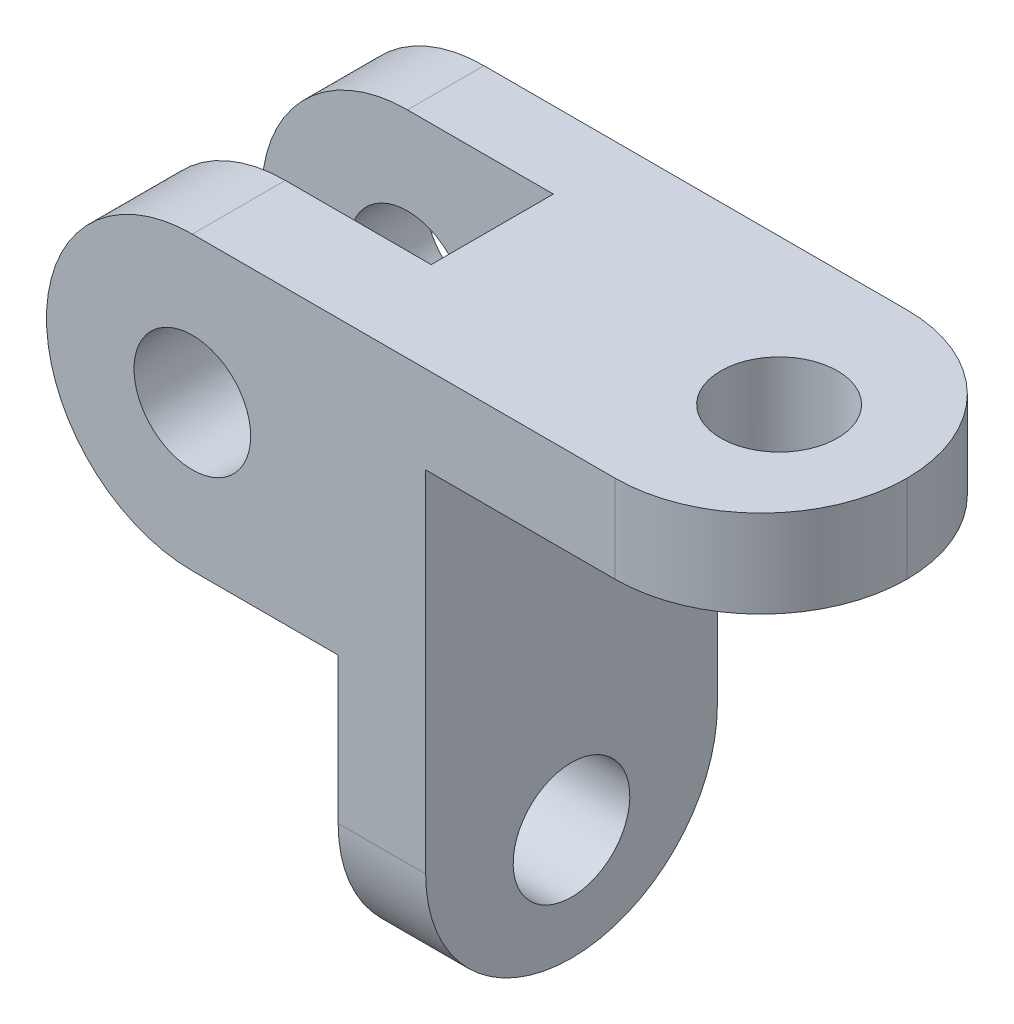
ISO-10303-21;
HEADER;
FILE_DESCRIPTION(('STEP AP214'),'2;1');
FILE_NAME('part.step','',(''),(''),'','','');
FILE_SCHEMA(('AUTOMOTIVE_DESIGN { 1 0 10303 214 1 1 1 1 }'));
ENDSEC;
DATA;
#1=APPLICATION_CONTEXT('core data for automotive mechanical design processes');
#2=APPLICATION_PROTOCOL_DEFINITION('international standard','automotive_design',2000,#1);
#3=PRODUCT_CONTEXT('',#1,'mechanical');
#4=PRODUCT('Part','Part','',(#3));
#5=PRODUCT_RELATED_PRODUCT_CATEGORY('part','',(#4));
#6=PRODUCT_DEFINITION_FORMATION('','',#4);
#7=PRODUCT_DEFINITION_CONTEXT('part definition',#1,'design');
#8=PRODUCT_DEFINITION('design','',#6,#7);
#9=PRODUCT_DEFINITION_SHAPE('','',#8);
#10=(LENGTH_UNIT() NAMED_UNIT(*) SI_UNIT(.MILLI.,.METRE.));
#11=(NAMED_UNIT(*) PLANE_ANGLE_UNIT() SI_UNIT($,.RADIAN.));
#12=(NAMED_UNIT(*) SI_UNIT($,.STERADIAN.) SOLID_ANGLE_UNIT());
#13=UNCERTAINTY_MEASURE_WITH_UNIT(LENGTH_MEASURE(1.E-05),#10,'distance_accuracy_value','');
#14=(GEOMETRIC_REPRESENTATION_CONTEXT(3) GLOBAL_UNCERTAINTY_ASSIGNED_CONTEXT((#13)) GLOBAL_UNIT_ASSIGNED_CONTEXT((#10,
#11,#12)) REPRESENTATION_CONTEXT('',''));
#15=CARTESIAN_POINT('',(0.,0.,0.));
#16=DIRECTION('',(0.,0.,1.));
#17=DIRECTION('',(1.,0.,0.));
#18=AXIS2_PLACEMENT_3D('',#15,#16,#17);
#19=CARTESIAN_POINT('',(0.,0.,20.));
#20=DIRECTION('',(0.,0.,-1.));
#21=DIRECTION('',(-1.,0.,0.));
#22=AXIS2_PLACEMENT_3D('',#19,#20,#21);
#23=CYLINDRICAL_SURFACE('',#22,20.);
#24=DIRECTION('',(0.,0.,-1.));
#25=VECTOR('',#24,1.);
#26=CARTESIAN_POINT('',(0.,-20.,20.));
#27=LINE('',#26,#25);
#28=CARTESIAN_POINT('',(0.,-20.,-9.50673794588815));
#29=VERTEX_POINT('',#28);
#30=CARTESIAN_POINT('',(0.,-20.,-20.));
#31=VERTEX_POINT('',#30);
#32=EDGE_CURVE('E264',#29,#31,#27,.T.);
#33=ORIENTED_EDGE('',*,*,#32,.F.);
#34=CARTESIAN_POINT('',(0.,0.,-9.50673794588815));
#35=DIRECTION('',(0.,0.,-1.));
#36=DIRECTION('',(-1.,0.,0.));
#37=AXIS2_PLACEMENT_3D('',#34,#35,#36);
#38=CIRCLE('',#37,20.);
#39=CARTESIAN_POINT('',(0.,20.,-9.50673794588815));
#40=VERTEX_POINT('',#39);
#41=EDGE_CURVE('E190',#29,#40,#38,.T.);
#42=ORIENTED_EDGE('',*,*,#41,.T.);
#43=DIRECTION('',(0.,0.,-1.));
#44=VECTOR('',#43,1.);
#45=CARTESIAN_POINT('',(0.,20.,20.));
#46=LINE('',#45,#44);
#47=CARTESIAN_POINT('',(0.,20.,-20.));
#48=VERTEX_POINT('',#47);
#49=EDGE_CURVE('E229',#40,#48,#46,.T.);
#50=ORIENTED_EDGE('',*,*,#49,.T.);
#51=CARTESIAN_POINT('',(0.,0.,-20.));
#52=DIRECTION('',(0.,0.,1.));
#53=DIRECTION('',(1.,0.,0.));
#54=AXIS2_PLACEMENT_3D('',#51,#52,#53);
#55=CIRCLE('',#54,20.);
#56=EDGE_CURVE('E234',#48,#31,#55,.T.);
#57=ORIENTED_EDGE('',*,*,#56,.T.);
#58=EDGE_LOOP('',(#33,#42,#50,#57));
#59=FACE_BOUND('',#58,.T.);
#60=ADVANCED_FACE('F36',(#59),#23,.T.);
#61=CARTESIAN_POINT('',(0.,-20.,20.));
#62=DIRECTION('',(0.,-1.,0.));
#63=DIRECTION('',(0.,0.,-1.));
#64=AXIS2_PLACEMENT_3D('',#61,#62,#63);
#65=PLANE('',#64);
#66=DIRECTION('',(1.,0.,0.));
#67=VECTOR('',#66,1.);
#68=CARTESIAN_POINT('',(20.,-20.,-9.50673794588815));
#69=LINE('',#68,#67);
#70=CARTESIAN_POINT('',(20.,-20.,-9.50673794588815));
#71=VERTEX_POINT('',#70);
#72=EDGE_CURVE('E167',#29,#71,#69,.T.);
#73=ORIENTED_EDGE('',*,*,#72,.F.);
#74=ORIENTED_EDGE('',*,*,#32,.T.);
#75=DIRECTION('',(-1.,0.,0.));
#76=VECTOR('',#75,1.);
#77=CARTESIAN_POINT('',(0.,-20.,-20.));
#78=LINE('',#77,#76);
#79=CARTESIAN_POINT('',(20.,-20.,-20.));
#80=VERTEX_POINT('',#79);
#81=EDGE_CURVE('E238',#80,#31,#78,.T.);
#82=ORIENTED_EDGE('',*,*,#81,.F.);
#83=DIRECTION('',(0.,0.,-1.));
#84=VECTOR('',#83,1.);
#85=CARTESIAN_POINT('',(20.,-20.,20.));
#86=LINE('',#85,#84);
#87=EDGE_CURVE('E261',#71,#80,#86,.T.);
#88=ORIENTED_EDGE('',*,*,#87,.F.);
#89=EDGE_LOOP('',(#73,#74,#82,#88));
#90=FACE_BOUND('',#89,.T.);
#91=ADVANCED_FACE('F399',(#90),#65,.T.);
#92=CARTESIAN_POINT('',(0.,0.,20.));
#93=DIRECTION('',(0.,0.,-1.));
#94=DIRECTION('',(-1.,0.,0.));
#95=AXIS2_PLACEMENT_3D('',#92,#93,#94);
#96=CYLINDRICAL_SURFACE('',#95,8.);
#97=CARTESIAN_POINT('',(0.,0.,-9.50673794588815));
#98=DIRECTION('',(0.,0.,-1.));
#99=DIRECTION('',(-1.,0.,0.));
#100=AXIS2_PLACEMENT_3D('',#97,#98,#99);
#101=CIRCLE('',#100,8.);
#102=CARTESIAN_POINT('',(-8.,0.,-9.50673794588815));
#103=VERTEX_POINT('',#102);
#104=EDGE_CURVE('E186',#103,#103,#101,.T.);
#105=ORIENTED_EDGE('',*,*,#104,.F.);
#106=EDGE_LOOP('',(#105));
#107=FACE_BOUND('',#106,.T.);
#108=CARTESIAN_POINT('',(0.,0.,-20.));
#109=DIRECTION('',(0.,0.,1.));
#110=DIRECTION('',(1.,0.,0.));
#111=AXIS2_PLACEMENT_3D('',#108,#109,#110);
#112=CIRCLE('',#111,8.);
#113=CARTESIAN_POINT('',(8.,0.,-20.));
#114=VERTEX_POINT('',#113);
#115=EDGE_CURVE('E230',#114,#114,#112,.T.);
#116=ORIENTED_EDGE('',*,*,#115,.F.);
#117=EDGE_LOOP('',(#116));
#118=FACE_BOUND('',#117,.T.);
#119=ADVANCED_FACE('F421',(#107,#118),#96,.F.);
#120=CARTESIAN_POINT('',(0.,20.,20.));
#121=VERTEX_POINT('',#120);
#122=CARTESIAN_POINT('',(0.,20.,7.2463946580546));
#123=VERTEX_POINT('',#122);
#124=EDGE_CURVE('E254',#121,#123,#46,.T.);
#125=ORIENTED_EDGE('',*,*,#124,.T.);
#126=CARTESIAN_POINT('',(0.,0.,7.2463946580546));
#127=DIRECTION('',(0.,0.,1.));
#128=DIRECTION('',(1.,0.,0.));
#129=AXIS2_PLACEMENT_3D('',#126,#127,#128);
#130=CIRCLE('',#129,20.);
#131=CARTESIAN_POINT('',(0.,-20.,7.2463946580546));
#132=VERTEX_POINT('',#131);
#133=EDGE_CURVE('E157',#123,#132,#130,.T.);
#134=ORIENTED_EDGE('',*,*,#133,.T.);
#135=CARTESIAN_POINT('',(0.,-20.,20.));
#136=VERTEX_POINT('',#135);
#137=EDGE_CURVE('E265',#136,#132,#27,.T.);
#138=ORIENTED_EDGE('',*,*,#137,.F.);
#139=CARTESIAN_POINT('',(0.,0.,20.));
#140=DIRECTION('',(0.,0.,1.));
#141=DIRECTION('',(1.,0.,0.));
#142=AXIS2_PLACEMENT_3D('',#139,#140,#141);
#143=CIRCLE('',#142,20.);
#144=EDGE_CURVE('E207',#121,#136,#143,.T.);
#145=ORIENTED_EDGE('',*,*,#144,.F.);
#146=EDGE_LOOP('',(#125,#134,#138,#145));
#147=FACE_BOUND('',#146,.T.);
#148=ADVANCED_FACE('F334',(#147),#23,.T.);
#149=DIRECTION('',(-1.,0.,0.));
#150=VECTOR('',#149,1.);
#151=CARTESIAN_POINT('',(20.,-20.,7.2463946580546));
#152=LINE('',#151,#150);
#153=CARTESIAN_POINT('',(20.,-20.,7.2463946580546));
#154=VERTEX_POINT('',#153);
#155=EDGE_CURVE('E171',#154,#132,#152,.T.);
#156=ORIENTED_EDGE('',*,*,#155,.F.);
#157=CARTESIAN_POINT('',(20.,-20.,20.));
#158=VERTEX_POINT('',#157);
#159=EDGE_CURVE('E147',#158,#154,#86,.T.);
#160=ORIENTED_EDGE('',*,*,#159,.F.);
#161=DIRECTION('',(-1.,0.,0.));
#162=VECTOR('',#161,1.);
#163=CARTESIAN_POINT('',(0.,-20.,20.));
#164=LINE('',#163,#162);
#165=EDGE_CURVE('E211',#158,#136,#164,.T.);
#166=ORIENTED_EDGE('',*,*,#165,.T.);
#167=ORIENTED_EDGE('',*,*,#137,.T.);
#168=EDGE_LOOP('',(#156,#160,#166,#167));
#169=FACE_BOUND('',#168,.T.);
#170=ADVANCED_FACE('F331',(#169),#65,.T.);
#171=CARTESIAN_POINT('',(20.,0.,20.));
#172=DIRECTION('',(-1.,0.,0.));
#173=DIRECTION('',(0.,0.,1.));
#174=AXIS2_PLACEMENT_3D('',#171,#172,#173);
#175=PLANE('',#174);
#176=CARTESIAN_POINT('',(20.,-44.7558540970053,0.));
#177=DIRECTION('',(-1.,0.,0.));
#178=DIRECTION('',(0.,0.,1.));
#179=AXIS2_PLACEMENT_3D('',#176,#177,#178);
#180=CIRCLE('',#179,8.);
#181=CARTESIAN_POINT('',(20.,-44.7558540970053,8.));
#182=VERTEX_POINT('',#181);
#183=EDGE_CURVE('E174',#182,#182,#180,.T.);
#184=ORIENTED_EDGE('',*,*,#183,.F.);
#185=EDGE_LOOP('',(#184));
#186=FACE_BOUND('',#185,.T.);
#187=DIRECTION('',(0.,1.,0.));
#188=VECTOR('',#187,1.);
#189=CARTESIAN_POINT('',(20.,0.,-20.));
#190=LINE('',#189,#188);
#191=CARTESIAN_POINT('',(20.,-40.,-20.));
#192=VERTEX_POINT('',#191);
#193=EDGE_CURVE('E242',#192,#80,#190,.T.);
#194=ORIENTED_EDGE('',*,*,#193,.F.);
#195=CARTESIAN_POINT('',(20.,-40.,0.));
#196=DIRECTION('',(-1.,0.,0.));
#197=DIRECTION('',(0.,0.,1.));
#198=AXIS2_PLACEMENT_3D('',#195,#196,#197);
#199=CIRCLE('',#198,20.);
#200=CARTESIAN_POINT('',(20.,-60.,0.));
#201=VERTEX_POINT('',#200);
#202=EDGE_CURVE('E46',#192,#201,#199,.T.);
#203=ORIENTED_EDGE('',*,*,#202,.T.);
#204=CARTESIAN_POINT('',(20.,-40.,0.));
#205=DIRECTION('',(-1.,0.,0.));
#206=DIRECTION('',(0.,0.,1.));
#207=AXIS2_PLACEMENT_3D('',#204,#205,#206);
#208=CIRCLE('',#207,20.);
#209=CARTESIAN_POINT('',(20.,-40.,20.));
#210=VERTEX_POINT('',#209);
#211=EDGE_CURVE('E296',#201,#210,#208,.T.);
#212=ORIENTED_EDGE('',*,*,#211,.T.);
#213=DIRECTION('',(0.,1.,0.));
#214=VECTOR('',#213,1.);
#215=CARTESIAN_POINT('',(20.,0.,20.));
#216=LINE('',#215,#214);
#217=EDGE_CURVE('E215',#210,#158,#216,.T.);
#218=ORIENTED_EDGE('',*,*,#217,.T.);
#219=ORIENTED_EDGE('',*,*,#159,.T.);
#220=DIRECTION('',(0.,-1.,0.));
#221=VECTOR('',#220,1.);
#222=CARTESIAN_POINT('',(20.,20.,7.2463946580546));
#223=LINE('',#222,#221);
#224=CARTESIAN_POINT('',(20.,20.,7.2463946580546));
#225=VERTEX_POINT('',#224);
#226=EDGE_CURVE('E138',#225,#154,#223,.T.);
#227=ORIENTED_EDGE('',*,*,#226,.F.);
#228=DIRECTION('',(0.,0.,1.));
#229=VECTOR('',#228,1.);
#230=CARTESIAN_POINT('',(20.,20.,-9.50673794588815));
#231=LINE('',#230,#229);
#232=CARTESIAN_POINT('',(20.,20.,-9.50673794588815));
#233=VERTEX_POINT('',#232);
#234=EDGE_CURVE('E144',#233,#225,#231,.T.);
#235=ORIENTED_EDGE('',*,*,#234,.F.);
#236=DIRECTION('',(0.,-1.,0.));
#237=VECTOR('',#236,1.);
#238=CARTESIAN_POINT('',(20.,20.,-9.50673794588815));
#239=LINE('',#238,#237);
#240=EDGE_CURVE('E151',#233,#71,#239,.T.);
#241=ORIENTED_EDGE('',*,*,#240,.T.);
#242=ORIENTED_EDGE('',*,*,#87,.T.);
#243=EDGE_LOOP('',(#194,#203,#212,#218,#219,#227,#235,#241,#242));
#244=FACE_BOUND('',#243,.T.);
#245=ADVANCED_FACE('F141',(#186,#244),#175,.T.);
#246=CARTESIAN_POINT('',(32.,0.,20.));
#247=DIRECTION('',(1.,0.,0.));
#248=DIRECTION('',(0.,1.,0.));
#249=AXIS2_PLACEMENT_3D('',#246,#247,#248);
#250=PLANE('',#249);
#251=CARTESIAN_POINT('',(32.,-44.7558540970053,0.));
#252=DIRECTION('',(1.,0.,0.));
#253=DIRECTION('',(0.,1.,0.));
#254=AXIS2_PLACEMENT_3D('',#251,#252,#253);
#255=CIRCLE('',#254,8.);
#256=CARTESIAN_POINT('',(32.,-36.7558540970053,0.));
#257=VERTEX_POINT('',#256);
#258=EDGE_CURVE('E40',#257,#257,#255,.T.);
#259=ORIENTED_EDGE('',*,*,#258,.F.);
#260=EDGE_LOOP('',(#259));
#261=FACE_BOUND('',#260,.T.);
#262=CARTESIAN_POINT('',(32.,-40.,0.));
#263=DIRECTION('',(1.,0.,0.));
#264=DIRECTION('',(0.,1.,0.));
#265=AXIS2_PLACEMENT_3D('',#262,#263,#264);
#266=CIRCLE('',#265,20.);
#267=CARTESIAN_POINT('',(32.,-40.,20.));
#268=VERTEX_POINT('',#267);
#269=CARTESIAN_POINT('',(32.,-60.,0.));
#270=VERTEX_POINT('',#269);
#271=EDGE_CURVE('E302',#268,#270,#266,.T.);
#272=ORIENTED_EDGE('',*,*,#271,.T.);
#273=CARTESIAN_POINT('',(32.,-40.,0.));
#274=DIRECTION('',(1.,0.,0.));
#275=DIRECTION('',(0.,1.,0.));
#276=AXIS2_PLACEMENT_3D('',#273,#274,#275);
#277=CIRCLE('',#276,20.);
#278=CARTESIAN_POINT('',(32.,-40.,-20.));
#279=VERTEX_POINT('',#278);
#280=EDGE_CURVE('E11',#270,#279,#277,.T.);
#281=ORIENTED_EDGE('',*,*,#280,.T.);
#282=DIRECTION('',(0.,-1.,0.));
#283=VECTOR('',#282,1.);
#284=CARTESIAN_POINT('',(32.,0.,-20.));
#285=LINE('',#284,#283);
#286=CARTESIAN_POINT('',(32.,7.99999999999999,-20.));
#287=VERTEX_POINT('',#286);
#288=EDGE_CURVE('E245',#287,#279,#285,.T.);
#289=ORIENTED_EDGE('',*,*,#288,.F.);
#290=DIRECTION('',(0.,0.,-1.));
#291=VECTOR('',#290,1.);
#292=CARTESIAN_POINT('',(32.,7.99999999999999,20.));
#293=LINE('',#292,#291);
#294=CARTESIAN_POINT('',(32.,7.99999999999999,20.));
#295=VERTEX_POINT('',#294);
#296=EDGE_CURVE('E257',#295,#287,#293,.T.);
#297=ORIENTED_EDGE('',*,*,#296,.F.);
#298=DIRECTION('',(0.,-1.,0.));
#299=VECTOR('',#298,1.);
#300=CARTESIAN_POINT('',(32.,0.,20.));
#301=LINE('',#300,#299);
#302=EDGE_CURVE('E218',#295,#268,#301,.T.);
#303=ORIENTED_EDGE('',*,*,#302,.T.);
#304=EDGE_LOOP('',(#272,#281,#289,#297,#303));
#305=FACE_BOUND('',#304,.T.);
#306=ADVANCED_FACE('F322',(#261,#305),#250,.T.);
#307=CARTESIAN_POINT('',(0.,7.99999999999999,20.));
#308=DIRECTION('',(0.,-1.,0.));
#309=DIRECTION('',(1.,0.,0.));
#310=AXIS2_PLACEMENT_3D('',#307,#308,#309);
#311=PLANE('',#310);
#312=CARTESIAN_POINT('',(60.4729021043227,7.99999999999999,0.));
#313=DIRECTION('',(0.,-1.,0.));
#314=DIRECTION('',(1.,0.,0.));
#315=AXIS2_PLACEMENT_3D('',#312,#313,#314);
#316=CIRCLE('',#315,8.00000000000001);
#317=CARTESIAN_POINT('',(68.4729021043227,8.,0.));
#318=VERTEX_POINT('',#317);
#319=EDGE_CURVE('E198',#318,#318,#316,.T.);
#320=ORIENTED_EDGE('',*,*,#319,.F.);
#321=EDGE_LOOP('',(#320));
#322=FACE_BOUND('',#321,.T.);
#323=DIRECTION('',(-1.,0.,0.));
#324=VECTOR('',#323,1.);
#325=CARTESIAN_POINT('',(0.,7.99999999999999,-20.));
#326=LINE('',#325,#324);
#327=CARTESIAN_POINT('',(58.,7.99999999999999,-20.));
#328=VERTEX_POINT('',#327);
#329=EDGE_CURVE('E248',#328,#287,#326,.T.);
#330=ORIENTED_EDGE('',*,*,#329,.F.);
#331=CARTESIAN_POINT('',(58.,7.99999999999999,0.));
#332=DIRECTION('',(0.,-1.,0.));
#333=DIRECTION('',(1.,0.,0.));
#334=AXIS2_PLACEMENT_3D('',#331,#332,#333);
#335=CIRCLE('',#334,20.);
#336=CARTESIAN_POINT('',(78.,8.,0.));
#337=VERTEX_POINT('',#336);
#338=EDGE_CURVE('E276',#328,#337,#335,.T.);
#339=ORIENTED_EDGE('',*,*,#338,.T.);
#340=CARTESIAN_POINT('',(58.,7.99999999999999,0.));
#341=DIRECTION('',(0.,-1.,0.));
#342=DIRECTION('',(1.,0.,0.));
#343=AXIS2_PLACEMENT_3D('',#340,#341,#342);
#344=CIRCLE('',#343,20.);
#345=CARTESIAN_POINT('',(58.,7.99999999999999,20.));
#346=VERTEX_POINT('',#345);
#347=EDGE_CURVE('E273',#337,#346,#344,.T.);
#348=ORIENTED_EDGE('',*,*,#347,.T.);
#349=DIRECTION('',(-1.,0.,0.));
#350=VECTOR('',#349,1.);
#351=CARTESIAN_POINT('',(0.,7.99999999999999,20.));
#352=LINE('',#351,#350);
#353=EDGE_CURVE('E222',#346,#295,#352,.T.);
#354=ORIENTED_EDGE('',*,*,#353,.T.);
#355=ORIENTED_EDGE('',*,*,#296,.T.);
#356=EDGE_LOOP('',(#330,#339,#348,#354,#355));
#357=FACE_BOUND('',#356,.T.);
#358=ADVANCED_FACE('F437',(#322,#357),#311,.T.);
#359=CARTESIAN_POINT('',(0.,0.,7.2463946580546));
#360=DIRECTION('',(0.,0.,1.));
#361=DIRECTION('',(1.,0.,0.));
#362=AXIS2_PLACEMENT_3D('',#359,#360,#361);
#363=CIRCLE('',#362,8.);
#364=CARTESIAN_POINT('',(8.,0.,7.2463946580546));
#365=VERTEX_POINT('',#364);
#366=EDGE_CURVE('E179',#365,#365,#363,.T.);
#367=ORIENTED_EDGE('',*,*,#366,.F.);
#368=EDGE_LOOP('',(#367));
#369=FACE_BOUND('',#368,.T.);
#370=CARTESIAN_POINT('',(0.,0.,20.));
#371=DIRECTION('',(0.,0.,1.));
#372=DIRECTION('',(1.,0.,0.));
#373=AXIS2_PLACEMENT_3D('',#370,#371,#372);
#374=CIRCLE('',#373,8.);
#375=CARTESIAN_POINT('',(8.,0.,20.));
#376=VERTEX_POINT('',#375);
#377=EDGE_CURVE('E203',#376,#376,#374,.T.);
#378=ORIENTED_EDGE('',*,*,#377,.T.);
#379=EDGE_LOOP('',(#378));
#380=FACE_BOUND('',#379,.T.);
#381=ADVANCED_FACE('F430',(#369,#380),#96,.F.);
#382=CARTESIAN_POINT('',(0.,20.,20.));
#383=DIRECTION('',(0.,1.,0.));
#384=DIRECTION('',(-1.,0.,0.));
#385=AXIS2_PLACEMENT_3D('',#382,#383,#384);
#386=PLANE('',#385);
#387=DIRECTION('',(-1.,0.,0.));
#388=VECTOR('',#387,1.);
#389=CARTESIAN_POINT('',(0.,20.,-9.50673794588815));
#390=LINE('',#389,#388);
#391=EDGE_CURVE('E165',#233,#40,#390,.T.);
#392=ORIENTED_EDGE('',*,*,#391,.F.);
#393=ORIENTED_EDGE('',*,*,#234,.T.);
#394=DIRECTION('',(-1.,0.,0.));
#395=VECTOR('',#394,1.);
#396=CARTESIAN_POINT('',(20.,20.,7.2463946580546));
#397=LINE('',#396,#395);
#398=EDGE_CURVE('E152',#225,#123,#397,.T.);
#399=ORIENTED_EDGE('',*,*,#398,.T.);
#400=ORIENTED_EDGE('',*,*,#124,.F.);
#401=DIRECTION('',(1.,0.,0.));
#402=VECTOR('',#401,1.);
#403=CARTESIAN_POINT('',(0.,20.,20.));
#404=LINE('',#403,#402);
#405=CARTESIAN_POINT('',(58.,20.,20.));
#406=VERTEX_POINT('',#405);
#407=EDGE_CURVE('E225',#121,#406,#404,.T.);
#408=ORIENTED_EDGE('',*,*,#407,.T.);
#409=CARTESIAN_POINT('',(58.,20.,0.));
#410=DIRECTION('',(0.,1.,0.));
#411=DIRECTION('',(-1.,0.,0.));
#412=AXIS2_PLACEMENT_3D('',#409,#410,#411);
#413=CIRCLE('',#412,20.);
#414=CARTESIAN_POINT('',(78.,20.,0.));
#415=VERTEX_POINT('',#414);
#416=EDGE_CURVE('E279',#406,#415,#413,.T.);
#417=ORIENTED_EDGE('',*,*,#416,.T.);
#418=CARTESIAN_POINT('',(58.,20.,0.));
#419=DIRECTION('',(0.,1.,0.));
#420=DIRECTION('',(-1.,0.,0.));
#421=AXIS2_PLACEMENT_3D('',#418,#419,#420);
#422=CIRCLE('',#421,20.);
#423=CARTESIAN_POINT('',(58.,20.,-20.));
#424=VERTEX_POINT('',#423);
#425=EDGE_CURVE('E282',#415,#424,#422,.T.);
#426=ORIENTED_EDGE('',*,*,#425,.T.);
#427=DIRECTION('',(1.,0.,0.));
#428=VECTOR('',#427,1.);
#429=CARTESIAN_POINT('',(0.,20.,-20.));
#430=LINE('',#429,#428);
#431=EDGE_CURVE('E208',#48,#424,#430,.T.);
#432=ORIENTED_EDGE('',*,*,#431,.F.);
#433=ORIENTED_EDGE('',*,*,#49,.F.);
#434=EDGE_LOOP('',(#392,#393,#399,#400,#408,#417,#426,#432,#433));
#435=FACE_BOUND('',#434,.T.);
#436=CARTESIAN_POINT('',(60.4729021043227,20.,0.));
#437=DIRECTION('',(0.,1.,0.));
#438=DIRECTION('',(-1.,0.,0.));
#439=AXIS2_PLACEMENT_3D('',#436,#437,#438);
#440=CIRCLE('',#439,8.00000000000001);
#441=CARTESIAN_POINT('',(52.4729021043226,20.,0.));
#442=VERTEX_POINT('',#441);
#443=EDGE_CURVE('E194',#442,#442,#440,.T.);
#444=ORIENTED_EDGE('',*,*,#443,.F.);
#445=EDGE_LOOP('',(#444));
#446=FACE_BOUND('',#445,.T.);
#447=ADVANCED_FACE('F162',(#435,#446),#386,.T.);
#448=CARTESIAN_POINT('',(0.,0.,20.));
#449=DIRECTION('',(0.,0.,1.));
#450=DIRECTION('',(1.,0.,0.));
#451=AXIS2_PLACEMENT_3D('',#448,#449,#450);
#452=PLANE('',#451);
#453=ORIENTED_EDGE('',*,*,#377,.F.);
#454=EDGE_LOOP('',(#453));
#455=FACE_BOUND('',#454,.T.);
#456=ORIENTED_EDGE('',*,*,#217,.F.);
#457=DIRECTION('',(-1.,0.,0.));
#458=VECTOR('',#457,1.);
#459=CARTESIAN_POINT('',(0.,-40.,20.));
#460=LINE('',#459,#458);
#461=EDGE_CURVE('E299',#210,#268,#460,.F.);
#462=ORIENTED_EDGE('',*,*,#461,.T.);
#463=ORIENTED_EDGE('',*,*,#302,.F.);
#464=ORIENTED_EDGE('',*,*,#353,.F.);
#465=DIRECTION('',(0.,-1.,0.));
#466=VECTOR('',#465,1.);
#467=CARTESIAN_POINT('',(57.9999999999999,0.,20.));
#468=LINE('',#467,#466);
#469=EDGE_CURVE('E285',#346,#406,#468,.F.);
#470=ORIENTED_EDGE('',*,*,#469,.T.);
#471=ORIENTED_EDGE('',*,*,#407,.F.);
#472=ORIENTED_EDGE('',*,*,#144,.T.);
#473=ORIENTED_EDGE('',*,*,#165,.F.);
#474=EDGE_LOOP('',(#456,#462,#463,#464,#470,#471,#472,#473));
#475=FACE_BOUND('',#474,.T.);
#476=ADVANCED_FACE('F327',(#455,#475),#452,.T.);
#477=CARTESIAN_POINT('',(0.,0.,-20.));
#478=DIRECTION('',(0.,0.,1.));
#479=DIRECTION('',(1.,0.,0.));
#480=AXIS2_PLACEMENT_3D('',#477,#478,#479);
#481=PLANE('',#480);
#482=ORIENTED_EDGE('',*,*,#115,.T.);
#483=EDGE_LOOP('',(#482));
#484=FACE_BOUND('',#483,.T.);
#485=ORIENTED_EDGE('',*,*,#288,.T.);
#486=DIRECTION('',(-1.,0.,0.));
#487=VECTOR('',#486,1.);
#488=CARTESIAN_POINT('',(20.,-40.,-20.));
#489=LINE('',#488,#487);
#490=EDGE_CURVE('E305',#279,#192,#489,.T.);
#491=ORIENTED_EDGE('',*,*,#490,.T.);
#492=ORIENTED_EDGE('',*,*,#193,.T.);
#493=ORIENTED_EDGE('',*,*,#81,.T.);
#494=ORIENTED_EDGE('',*,*,#56,.F.);
#495=ORIENTED_EDGE('',*,*,#431,.T.);
#496=DIRECTION('',(0.,-1.,0.));
#497=VECTOR('',#496,1.);
#498=CARTESIAN_POINT('',(58.,8.00000000000002,-20.));
#499=LINE('',#498,#497);
#500=EDGE_CURVE('E269',#424,#328,#499,.T.);
#501=ORIENTED_EDGE('',*,*,#500,.T.);
#502=ORIENTED_EDGE('',*,*,#329,.T.);
#503=EDGE_LOOP('',(#485,#491,#492,#493,#494,#495,#501,#502));
#504=FACE_BOUND('',#503,.T.);
#505=ADVANCED_FACE('F319',(#484,#504),#481,.F.);
#506=CARTESIAN_POINT('',(57.9999999999999,0.,0.));
#507=DIRECTION('',(0.,-1.,0.));
#508=DIRECTION('',(1.,0.,0.));
#509=AXIS2_PLACEMENT_3D('',#506,#507,#508);
#510=CYLINDRICAL_SURFACE('',#509,20.);
#511=DIRECTION('',(0.,-1.,0.));
#512=VECTOR('',#511,1.);
#513=CARTESIAN_POINT('',(77.9999999999999,0.,0.));
#514=LINE('',#513,#512);
#515=EDGE_CURVE('E202',#415,#337,#514,.T.);
#516=ORIENTED_EDGE('',*,*,#515,.F.);
#517=ORIENTED_EDGE('',*,*,#416,.F.);
#518=ORIENTED_EDGE('',*,*,#469,.F.);
#519=ORIENTED_EDGE('',*,*,#347,.F.);
#520=EDGE_LOOP('',(#516,#517,#518,#519));
#521=FACE_BOUND('',#520,.T.);
#522=ADVANCED_FACE('F340',(#521),#510,.T.);
#523=CARTESIAN_POINT('',(57.9999999999999,0.,0.));
#524=DIRECTION('',(0.,1.,0.));
#525=DIRECTION('',(-1.,0.,0.));
#526=AXIS2_PLACEMENT_3D('',#523,#524,#525);
#527=CYLINDRICAL_SURFACE('',#526,20.);
#528=ORIENTED_EDGE('',*,*,#425,.F.);
#529=ORIENTED_EDGE('',*,*,#515,.T.);
#530=ORIENTED_EDGE('',*,*,#338,.F.);
#531=ORIENTED_EDGE('',*,*,#500,.F.);
#532=EDGE_LOOP('',(#528,#529,#530,#531));
#533=FACE_BOUND('',#532,.T.);
#534=ADVANCED_FACE('F345',(#533),#527,.T.);
#535=CARTESIAN_POINT('',(60.4729021043227,4.,0.));
#536=DIRECTION('',(0.,1.,0.));
#537=DIRECTION('',(-1.,0.,0.));
#538=AXIS2_PLACEMENT_3D('',#535,#536,#537);
#539=CYLINDRICAL_SURFACE('',#538,8.00000000000001);
#540=ORIENTED_EDGE('',*,*,#319,.T.);
#541=EDGE_LOOP('',(#540));
#542=FACE_BOUND('',#541,.T.);
#543=ORIENTED_EDGE('',*,*,#443,.T.);
#544=EDGE_LOOP('',(#543));
#545=FACE_BOUND('',#544,.T.);
#546=ADVANCED_FACE('F404',(#542,#545),#539,.F.);
#547=CARTESIAN_POINT('',(20.,20.,-9.50673794588815));
#548=DIRECTION('',(0.,0.,-1.));
#549=DIRECTION('',(-1.,0.,0.));
#550=AXIS2_PLACEMENT_3D('',#547,#548,#549);
#551=PLANE('',#550);
#552=ORIENTED_EDGE('',*,*,#104,.T.);
#553=EDGE_LOOP('',(#552));
#554=FACE_BOUND('',#553,.T.);
#555=ORIENTED_EDGE('',*,*,#72,.T.);
#556=ORIENTED_EDGE('',*,*,#240,.F.);
#557=ORIENTED_EDGE('',*,*,#391,.T.);
#558=ORIENTED_EDGE('',*,*,#41,.F.);
#559=EDGE_LOOP('',(#555,#556,#557,#558));
#560=FACE_BOUND('',#559,.T.);
#561=ADVANCED_FACE('F402',(#554,#560),#551,.F.);
#562=CARTESIAN_POINT('',(20.,20.,7.2463946580546));
#563=DIRECTION('',(0.,0.,1.));
#564=DIRECTION('',(1.,0.,0.));
#565=AXIS2_PLACEMENT_3D('',#562,#563,#564);
#566=PLANE('',#565);
#567=ORIENTED_EDGE('',*,*,#366,.T.);
#568=EDGE_LOOP('',(#567));
#569=FACE_BOUND('',#568,.T.);
#570=ORIENTED_EDGE('',*,*,#398,.F.);
#571=ORIENTED_EDGE('',*,*,#226,.T.);
#572=ORIENTED_EDGE('',*,*,#155,.T.);
#573=ORIENTED_EDGE('',*,*,#133,.F.);
#574=EDGE_LOOP('',(#570,#571,#572,#573));
#575=FACE_BOUND('',#574,.T.);
#576=ADVANCED_FACE('F155',(#569,#575),#566,.F.);
#577=CARTESIAN_POINT('',(0.,-40.,0.));
#578=DIRECTION('',(-1.,0.,0.));
#579=DIRECTION('',(0.,-1.,0.));
#580=AXIS2_PLACEMENT_3D('',#577,#578,#579);
#581=CYLINDRICAL_SURFACE('',#580,20.);
#582=ORIENTED_EDGE('',*,*,#271,.F.);
#583=ORIENTED_EDGE('',*,*,#461,.F.);
#584=ORIENTED_EDGE('',*,*,#211,.F.);
#585=DIRECTION('',(-1.,0.,0.));
#586=VECTOR('',#585,1.);
#587=CARTESIAN_POINT('',(0.,-60.,0.));
#588=LINE('',#587,#586);
#589=EDGE_CURVE('E293',#270,#201,#588,.T.);
#590=ORIENTED_EDGE('',*,*,#589,.F.);
#591=EDGE_LOOP('',(#582,#583,#584,#590));
#592=FACE_BOUND('',#591,.T.);
#593=ADVANCED_FACE('F317',(#592),#581,.T.);
#594=CARTESIAN_POINT('',(0.,-40.,0.));
#595=DIRECTION('',(1.,0.,0.));
#596=DIRECTION('',(0.,1.,0.));
#597=AXIS2_PLACEMENT_3D('',#594,#595,#596);
#598=CYLINDRICAL_SURFACE('',#597,20.);
#599=ORIENTED_EDGE('',*,*,#280,.F.);
#600=ORIENTED_EDGE('',*,*,#589,.T.);
#601=ORIENTED_EDGE('',*,*,#202,.F.);
#602=ORIENTED_EDGE('',*,*,#490,.F.);
#603=EDGE_LOOP('',(#599,#600,#601,#602));
#604=FACE_BOUND('',#603,.T.);
#605=ADVANCED_FACE('F38',(#604),#598,.T.);
#606=CARTESIAN_POINT('',(-20.,-44.7558540970053,0.));
#607=DIRECTION('',(1.,0.,0.));
#608=DIRECTION('',(0.,1.,0.));
#609=AXIS2_PLACEMENT_3D('',#606,#607,#608);
#610=CYLINDRICAL_SURFACE('',#609,8.);
#611=ORIENTED_EDGE('',*,*,#183,.T.);
#612=EDGE_LOOP('',(#611));
#613=FACE_BOUND('',#612,.T.);
#614=ORIENTED_EDGE('',*,*,#258,.T.);
#615=EDGE_LOOP('',(#614));
#616=FACE_BOUND('',#615,.T.);
#617=ADVANCED_FACE('F475',(#613,#616),#610,.F.);
#618=CLOSED_SHELL('',(#60,#91,#119,#148,#170,#245,#306,#358,#381,#447,#476,#505,#522,#534,#546,
#561,#576,#593,#605,#617));
#619=MANIFOLD_SOLID_BREP('B2',#618);
#620=ADVANCED_BREP_SHAPE_REPRESENTATION('',(#18,#619),#14);
#621=SHAPE_DEFINITION_REPRESENTATION(#9,#620);
ENDSEC;
END-ISO-10303-21;
